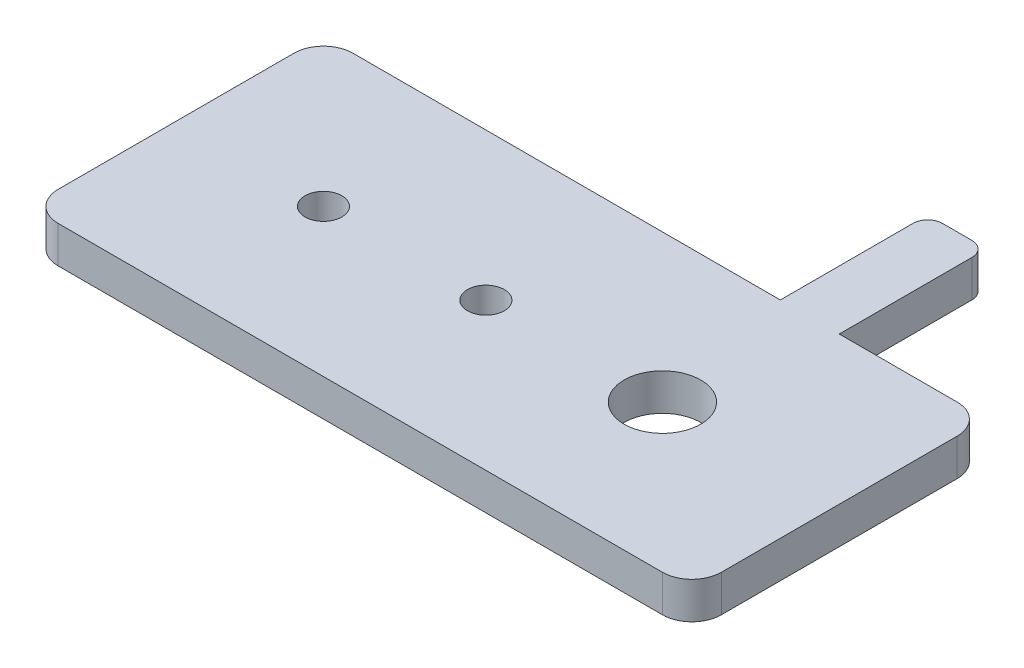
ISO-10303-21;
HEADER;
FILE_DESCRIPTION(('STEP AP214'),'2;1');
FILE_NAME('part.step','',(''),(''),'','','');
FILE_SCHEMA(('AUTOMOTIVE_DESIGN { 1 0 10303 214 1 1 1 1 }'));
ENDSEC;
DATA;
#1=APPLICATION_CONTEXT('core data for automotive mechanical design processes');
#2=APPLICATION_PROTOCOL_DEFINITION('international standard','automotive_design',2000,#1);
#3=PRODUCT_CONTEXT('',#1,'mechanical');
#4=PRODUCT('Part','Part','',(#3));
#5=PRODUCT_RELATED_PRODUCT_CATEGORY('part','',(#4));
#6=PRODUCT_DEFINITION_FORMATION('','',#4);
#7=PRODUCT_DEFINITION_CONTEXT('part definition',#1,'design');
#8=PRODUCT_DEFINITION('design','',#6,#7);
#9=PRODUCT_DEFINITION_SHAPE('','',#8);
#10=(LENGTH_UNIT() NAMED_UNIT(*) SI_UNIT(.MILLI.,.METRE.));
#11=(NAMED_UNIT(*) PLANE_ANGLE_UNIT() SI_UNIT($,.RADIAN.));
#12=(NAMED_UNIT(*) SI_UNIT($,.STERADIAN.) SOLID_ANGLE_UNIT());
#13=UNCERTAINTY_MEASURE_WITH_UNIT(LENGTH_MEASURE(1.E-05),#10,'distance_accuracy_value','');
#14=(GEOMETRIC_REPRESENTATION_CONTEXT(3) GLOBAL_UNCERTAINTY_ASSIGNED_CONTEXT((#13)) GLOBAL_UNIT_ASSIGNED_CONTEXT((#10,
#11,#12)) REPRESENTATION_CONTEXT('',''));
#15=CARTESIAN_POINT('',(0.,0.,0.));
#16=DIRECTION('',(0.,0.,1.));
#17=DIRECTION('',(1.,0.,0.));
#18=AXIS2_PLACEMENT_3D('',#15,#16,#17);
#19=CARTESIAN_POINT('',(54.61,3.175,-2.54));
#20=DIRECTION('',(0.,-1.,0.));
#21=DIRECTION('',(0.,0.,-1.));
#22=AXIS2_PLACEMENT_3D('',#19,#20,#21);
#23=CYLINDRICAL_SURFACE('',#22,2.54);
#24=CARTESIAN_POINT('',(54.61,0.,-2.54));
#25=DIRECTION('',(0.,1.,0.));
#26=DIRECTION('',(0.,0.,1.));
#27=AXIS2_PLACEMENT_3D('',#24,#25,#26);
#28=CIRCLE('',#27,2.54);
#29=CARTESIAN_POINT('',(54.61,0.,0.));
#30=VERTEX_POINT('',#29);
#31=CARTESIAN_POINT('',(57.15,0.,-2.54));
#32=VERTEX_POINT('',#31);
#33=EDGE_CURVE('E167',#30,#32,#28,.T.);
#34=ORIENTED_EDGE('',*,*,#33,.T.);
#35=DIRECTION('',(0.,-1.,0.));
#36=VECTOR('',#35,1.);
#37=CARTESIAN_POINT('',(57.15,3.175,-2.54));
#38=LINE('',#37,#36);
#39=CARTESIAN_POINT('',(57.15,3.175,-2.54));
#40=VERTEX_POINT('',#39);
#41=EDGE_CURVE('E11',#40,#32,#38,.T.);
#42=ORIENTED_EDGE('',*,*,#41,.F.);
#43=CARTESIAN_POINT('',(54.61,3.175,-2.54));
#44=DIRECTION('',(0.,1.,0.));
#45=DIRECTION('',(0.,0.,1.));
#46=AXIS2_PLACEMENT_3D('',#43,#44,#45);
#47=CIRCLE('',#46,2.54);
#48=CARTESIAN_POINT('',(54.61,3.175,0.));
#49=VERTEX_POINT('',#48);
#50=EDGE_CURVE('E194',#49,#40,#47,.T.);
#51=ORIENTED_EDGE('',*,*,#50,.F.);
#52=DIRECTION('',(0.,-1.,0.));
#53=VECTOR('',#52,1.);
#54=CARTESIAN_POINT('',(54.61,3.175,0.));
#55=LINE('',#54,#53);
#56=EDGE_CURVE('E163',#49,#30,#55,.T.);
#57=ORIENTED_EDGE('',*,*,#56,.T.);
#58=EDGE_LOOP('',(#34,#42,#51,#57));
#59=FACE_BOUND('',#58,.T.);
#60=ADVANCED_FACE('F35',(#59),#23,.T.);
#61=CARTESIAN_POINT('',(57.15,3.175,-2.54));
#62=DIRECTION('',(-1.,0.,0.));
#63=DIRECTION('',(0.,0.,1.));
#64=AXIS2_PLACEMENT_3D('',#61,#62,#63);
#65=PLANE('',#64);
#66=DIRECTION('',(0.,0.,-1.));
#67=VECTOR('',#66,1.);
#68=CARTESIAN_POINT('',(57.15,0.,-2.54));
#69=LINE('',#68,#67);
#70=CARTESIAN_POINT('',(57.15,0.,-22.86));
#71=VERTEX_POINT('',#70);
#72=EDGE_CURVE('E170',#32,#71,#69,.T.);
#73=ORIENTED_EDGE('',*,*,#72,.T.);
#74=DIRECTION('',(0.,-1.,0.));
#75=VECTOR('',#74,1.);
#76=CARTESIAN_POINT('',(57.15,3.175,-22.86));
#77=LINE('',#76,#75);
#78=CARTESIAN_POINT('',(57.15,3.175,-22.86));
#79=VERTEX_POINT('',#78);
#80=EDGE_CURVE('E43',#79,#71,#77,.T.);
#81=ORIENTED_EDGE('',*,*,#80,.F.);
#82=DIRECTION('',(0.,0.,-1.));
#83=VECTOR('',#82,1.);
#84=CARTESIAN_POINT('',(57.15,3.175,-2.54));
#85=LINE('',#84,#83);
#86=EDGE_CURVE('E112',#40,#79,#85,.T.);
#87=ORIENTED_EDGE('',*,*,#86,.F.);
#88=ORIENTED_EDGE('',*,*,#41,.T.);
#89=EDGE_LOOP('',(#73,#81,#87,#88));
#90=FACE_BOUND('',#89,.T.);
#91=ADVANCED_FACE('F283',(#90),#65,.F.);
#92=CARTESIAN_POINT('',(54.61,3.175,-22.86));
#93=DIRECTION('',(0.,-1.,0.));
#94=DIRECTION('',(0.,0.,-1.));
#95=AXIS2_PLACEMENT_3D('',#92,#93,#94);
#96=CYLINDRICAL_SURFACE('',#95,2.54);
#97=CARTESIAN_POINT('',(54.61,0.,-22.86));
#98=DIRECTION('',(0.,1.,0.));
#99=DIRECTION('',(0.,0.,-1.));
#100=AXIS2_PLACEMENT_3D('',#97,#98,#99);
#101=CIRCLE('',#100,2.54);
#102=CARTESIAN_POINT('',(54.61,0.,-25.4));
#103=VERTEX_POINT('',#102);
#104=EDGE_CURVE('E173',#71,#103,#101,.T.);
#105=ORIENTED_EDGE('',*,*,#104,.T.);
#106=DIRECTION('',(0.,-1.,0.));
#107=VECTOR('',#106,1.);
#108=CARTESIAN_POINT('',(54.61,3.175,-25.4));
#109=LINE('',#108,#107);
#110=CARTESIAN_POINT('',(54.61,3.175,-25.4));
#111=VERTEX_POINT('',#110);
#112=EDGE_CURVE('E219',#111,#103,#109,.T.);
#113=ORIENTED_EDGE('',*,*,#112,.F.);
#114=CARTESIAN_POINT('',(54.61,3.175,-22.86));
#115=DIRECTION('',(0.,1.,0.));
#116=DIRECTION('',(0.,0.,-1.));
#117=AXIS2_PLACEMENT_3D('',#114,#115,#116);
#118=CIRCLE('',#117,2.54);
#119=EDGE_CURVE('E227',#79,#111,#118,.T.);
#120=ORIENTED_EDGE('',*,*,#119,.F.);
#121=ORIENTED_EDGE('',*,*,#80,.T.);
#122=EDGE_LOOP('',(#105,#113,#120,#121));
#123=FACE_BOUND('',#122,.T.);
#124=ADVANCED_FACE('F225',(#123),#96,.T.);
#125=CARTESIAN_POINT('',(44.45,3.175,-25.4));
#126=DIRECTION('',(0.,0.,1.));
#127=DIRECTION('',(1.,0.,0.));
#128=AXIS2_PLACEMENT_3D('',#125,#126,#127);
#129=PLANE('',#128);
#130=DIRECTION('',(-1.,0.,0.));
#131=VECTOR('',#130,1.);
#132=CARTESIAN_POINT('',(44.45,0.,-25.4));
#133=LINE('',#132,#131);
#134=CARTESIAN_POINT('',(44.45,0.,-25.4));
#135=VERTEX_POINT('',#134);
#136=EDGE_CURVE('E175',#103,#135,#133,.T.);
#137=ORIENTED_EDGE('',*,*,#136,.T.);
#138=DIRECTION('',(0.,-1.,0.));
#139=VECTOR('',#138,1.);
#140=CARTESIAN_POINT('',(44.45,3.175,-25.4));
#141=LINE('',#140,#139);
#142=CARTESIAN_POINT('',(44.45,3.175,-25.4));
#143=VERTEX_POINT('',#142);
#144=EDGE_CURVE('E216',#143,#135,#141,.T.);
#145=ORIENTED_EDGE('',*,*,#144,.F.);
#146=DIRECTION('',(-1.,0.,0.));
#147=VECTOR('',#146,1.);
#148=CARTESIAN_POINT('',(44.45,3.175,-25.4));
#149=LINE('',#148,#147);
#150=EDGE_CURVE('E245',#111,#143,#149,.T.);
#151=ORIENTED_EDGE('',*,*,#150,.F.);
#152=ORIENTED_EDGE('',*,*,#112,.T.);
#153=EDGE_LOOP('',(#137,#145,#151,#152));
#154=FACE_BOUND('',#153,.T.);
#155=ADVANCED_FACE('F236',(#154),#129,.F.);
#156=CARTESIAN_POINT('',(44.45,3.175,-25.4));
#157=DIRECTION('',(-1.,0.,0.));
#158=DIRECTION('',(0.,0.,1.));
#159=AXIS2_PLACEMENT_3D('',#156,#157,#158);
#160=PLANE('',#159);
#161=DIRECTION('',(0.,0.,-1.));
#162=VECTOR('',#161,1.);
#163=CARTESIAN_POINT('',(44.45,0.,-25.4));
#164=LINE('',#163,#162);
#165=CARTESIAN_POINT('',(44.45,0.,-36.83));
#166=VERTEX_POINT('',#165);
#167=EDGE_CURVE('E177',#135,#166,#164,.T.);
#168=ORIENTED_EDGE('',*,*,#167,.T.);
#169=DIRECTION('',(0.,-1.,0.));
#170=VECTOR('',#169,1.);
#171=CARTESIAN_POINT('',(44.45,3.175,-36.83));
#172=LINE('',#171,#170);
#173=CARTESIAN_POINT('',(44.45,3.175,-36.83));
#174=VERTEX_POINT('',#173);
#175=EDGE_CURVE('E213',#174,#166,#172,.T.);
#176=ORIENTED_EDGE('',*,*,#175,.F.);
#177=DIRECTION('',(0.,0.,-1.));
#178=VECTOR('',#177,1.);
#179=CARTESIAN_POINT('',(44.45,3.175,-25.4));
#180=LINE('',#179,#178);
#181=EDGE_CURVE('E242',#143,#174,#180,.T.);
#182=ORIENTED_EDGE('',*,*,#181,.F.);
#183=ORIENTED_EDGE('',*,*,#144,.T.);
#184=EDGE_LOOP('',(#168,#176,#182,#183));
#185=FACE_BOUND('',#184,.T.);
#186=ADVANCED_FACE('F240',(#185),#160,.F.);
#187=CARTESIAN_POINT('',(43.18,3.175,-36.83));
#188=DIRECTION('',(0.,-1.,0.));
#189=DIRECTION('',(0.,0.,-1.));
#190=AXIS2_PLACEMENT_3D('',#187,#188,#189);
#191=CYLINDRICAL_SURFACE('',#190,1.27);
#192=CARTESIAN_POINT('',(43.18,0.,-36.83));
#193=DIRECTION('',(0.,1.,0.));
#194=DIRECTION('',(0.,0.,-1.));
#195=AXIS2_PLACEMENT_3D('',#192,#193,#194);
#196=CIRCLE('',#195,1.27);
#197=CARTESIAN_POINT('',(43.18,0.,-38.1));
#198=VERTEX_POINT('',#197);
#199=EDGE_CURVE('E179',#166,#198,#196,.T.);
#200=ORIENTED_EDGE('',*,*,#199,.T.);
#201=DIRECTION('',(0.,-1.,0.));
#202=VECTOR('',#201,1.);
#203=CARTESIAN_POINT('',(43.18,3.175,-38.1));
#204=LINE('',#203,#202);
#205=CARTESIAN_POINT('',(43.18,3.175,-38.1));
#206=VERTEX_POINT('',#205);
#207=EDGE_CURVE('E210',#206,#198,#204,.T.);
#208=ORIENTED_EDGE('',*,*,#207,.F.);
#209=CARTESIAN_POINT('',(43.18,3.175,-36.83));
#210=DIRECTION('',(0.,1.,0.));
#211=DIRECTION('',(0.,0.,-1.));
#212=AXIS2_PLACEMENT_3D('',#209,#210,#211);
#213=CIRCLE('',#212,1.27);
#214=EDGE_CURVE('E244',#174,#206,#213,.T.);
#215=ORIENTED_EDGE('',*,*,#214,.F.);
#216=ORIENTED_EDGE('',*,*,#175,.T.);
#217=EDGE_LOOP('',(#200,#208,#215,#216));
#218=FACE_BOUND('',#217,.T.);
#219=ADVANCED_FACE('F296',(#218),#191,.T.);
#220=CARTESIAN_POINT('',(40.64,3.175,-38.1));
#221=DIRECTION('',(0.,0.,1.));
#222=DIRECTION('',(1.,0.,0.));
#223=AXIS2_PLACEMENT_3D('',#220,#221,#222);
#224=PLANE('',#223);
#225=DIRECTION('',(-1.,0.,0.));
#226=VECTOR('',#225,1.);
#227=CARTESIAN_POINT('',(40.64,0.,-38.1));
#228=LINE('',#227,#226);
#229=CARTESIAN_POINT('',(40.64,0.,-38.1));
#230=VERTEX_POINT('',#229);
#231=EDGE_CURVE('E181',#198,#230,#228,.T.);
#232=ORIENTED_EDGE('',*,*,#231,.T.);
#233=DIRECTION('',(0.,-1.,0.));
#234=VECTOR('',#233,1.);
#235=CARTESIAN_POINT('',(40.64,3.175,-38.1));
#236=LINE('',#235,#234);
#237=CARTESIAN_POINT('',(40.64,3.175,-38.1));
#238=VERTEX_POINT('',#237);
#239=EDGE_CURVE('E207',#238,#230,#236,.T.);
#240=ORIENTED_EDGE('',*,*,#239,.F.);
#241=DIRECTION('',(-1.,0.,0.));
#242=VECTOR('',#241,1.);
#243=CARTESIAN_POINT('',(40.64,3.175,-38.1));
#244=LINE('',#243,#242);
#245=EDGE_CURVE('E247',#206,#238,#244,.T.);
#246=ORIENTED_EDGE('',*,*,#245,.F.);
#247=ORIENTED_EDGE('',*,*,#207,.T.);
#248=EDGE_LOOP('',(#232,#240,#246,#247));
#249=FACE_BOUND('',#248,.T.);
#250=ADVANCED_FACE('F299',(#249),#224,.F.);
#251=CARTESIAN_POINT('',(40.64,3.175,-36.83));
#252=DIRECTION('',(0.,-1.,0.));
#253=DIRECTION('',(0.,0.,-1.));
#254=AXIS2_PLACEMENT_3D('',#251,#252,#253);
#255=CYLINDRICAL_SURFACE('',#254,1.27);
#256=CARTESIAN_POINT('',(40.64,0.,-36.83));
#257=DIRECTION('',(0.,1.,0.));
#258=DIRECTION('',(0.,0.,-1.));
#259=AXIS2_PLACEMENT_3D('',#256,#257,#258);
#260=CIRCLE('',#259,1.27);
#261=CARTESIAN_POINT('',(39.37,0.,-36.83));
#262=VERTEX_POINT('',#261);
#263=EDGE_CURVE('E183',#230,#262,#260,.T.);
#264=ORIENTED_EDGE('',*,*,#263,.T.);
#265=DIRECTION('',(0.,-1.,0.));
#266=VECTOR('',#265,1.);
#267=CARTESIAN_POINT('',(39.37,3.175,-36.83));
#268=LINE('',#267,#266);
#269=CARTESIAN_POINT('',(39.37,3.175,-36.83));
#270=VERTEX_POINT('',#269);
#271=EDGE_CURVE('E204',#270,#262,#268,.T.);
#272=ORIENTED_EDGE('',*,*,#271,.F.);
#273=CARTESIAN_POINT('',(40.64,3.175,-36.83));
#274=DIRECTION('',(0.,1.,0.));
#275=DIRECTION('',(0.,0.,-1.));
#276=AXIS2_PLACEMENT_3D('',#273,#274,#275);
#277=CIRCLE('',#276,1.27);
#278=EDGE_CURVE('E253',#238,#270,#277,.T.);
#279=ORIENTED_EDGE('',*,*,#278,.F.);
#280=ORIENTED_EDGE('',*,*,#239,.T.);
#281=EDGE_LOOP('',(#264,#272,#279,#280));
#282=FACE_BOUND('',#281,.T.);
#283=ADVANCED_FACE('F303',(#282),#255,.T.);
#284=CARTESIAN_POINT('',(39.37,3.175,-25.4));
#285=DIRECTION('',(1.,0.,0.));
#286=DIRECTION('',(0.,0.,-1.));
#287=AXIS2_PLACEMENT_3D('',#284,#285,#286);
#288=PLANE('',#287);
#289=DIRECTION('',(0.,0.,1.));
#290=VECTOR('',#289,1.);
#291=CARTESIAN_POINT('',(39.37,0.,-25.4));
#292=LINE('',#291,#290);
#293=CARTESIAN_POINT('',(39.37,0.,-25.4));
#294=VERTEX_POINT('',#293);
#295=EDGE_CURVE('E185',#262,#294,#292,.T.);
#296=ORIENTED_EDGE('',*,*,#295,.T.);
#297=DIRECTION('',(0.,-1.,0.));
#298=VECTOR('',#297,1.);
#299=CARTESIAN_POINT('',(39.37,3.175,-25.4));
#300=LINE('',#299,#298);
#301=CARTESIAN_POINT('',(39.37,3.175,-25.4));
#302=VERTEX_POINT('',#301);
#303=EDGE_CURVE('E201',#302,#294,#300,.T.);
#304=ORIENTED_EDGE('',*,*,#303,.F.);
#305=DIRECTION('',(0.,0.,1.));
#306=VECTOR('',#305,1.);
#307=CARTESIAN_POINT('',(39.37,3.175,-25.4));
#308=LINE('',#307,#306);
#309=EDGE_CURVE('E255',#270,#302,#308,.T.);
#310=ORIENTED_EDGE('',*,*,#309,.F.);
#311=ORIENTED_EDGE('',*,*,#271,.T.);
#312=EDGE_LOOP('',(#296,#304,#310,#311));
#313=FACE_BOUND('',#312,.T.);
#314=ADVANCED_FACE('F307',(#313),#288,.F.);
#315=CARTESIAN_POINT('',(2.54000000000002,3.175,-25.4));
#316=DIRECTION('',(0.,0.,1.));
#317=DIRECTION('',(1.,0.,0.));
#318=AXIS2_PLACEMENT_3D('',#315,#316,#317);
#319=PLANE('',#318);
#320=DIRECTION('',(-1.,0.,0.));
#321=VECTOR('',#320,1.);
#322=CARTESIAN_POINT('',(2.54000000000002,0.,-25.4));
#323=LINE('',#322,#321);
#324=CARTESIAN_POINT('',(2.54000000000002,0.,-25.4));
#325=VERTEX_POINT('',#324);
#326=EDGE_CURVE('E187',#294,#325,#323,.T.);
#327=ORIENTED_EDGE('',*,*,#326,.T.);
#328=DIRECTION('',(0.,-1.,0.));
#329=VECTOR('',#328,1.);
#330=CARTESIAN_POINT('',(2.54000000000002,3.175,-25.4));
#331=LINE('',#330,#329);
#332=CARTESIAN_POINT('',(2.54000000000002,3.175,-25.4));
#333=VERTEX_POINT('',#332);
#334=EDGE_CURVE('E198',#333,#325,#331,.T.);
#335=ORIENTED_EDGE('',*,*,#334,.F.);
#336=DIRECTION('',(-1.,0.,0.));
#337=VECTOR('',#336,1.);
#338=CARTESIAN_POINT('',(2.54000000000002,3.175,-25.4));
#339=LINE('',#338,#337);
#340=EDGE_CURVE('E257',#302,#333,#339,.T.);
#341=ORIENTED_EDGE('',*,*,#340,.F.);
#342=ORIENTED_EDGE('',*,*,#303,.T.);
#343=EDGE_LOOP('',(#327,#335,#341,#342));
#344=FACE_BOUND('',#343,.T.);
#345=ADVANCED_FACE('F263',(#344),#319,.F.);
#346=CARTESIAN_POINT('',(2.54,3.175,-22.86));
#347=DIRECTION('',(0.,-1.,0.));
#348=DIRECTION('',(0.,0.,-1.));
#349=AXIS2_PLACEMENT_3D('',#346,#347,#348);
#350=CYLINDRICAL_SURFACE('',#349,2.54);
#351=CARTESIAN_POINT('',(2.54,0.,-22.86));
#352=DIRECTION('',(0.,1.,0.));
#353=DIRECTION('',(0.,0.,-1.));
#354=AXIS2_PLACEMENT_3D('',#351,#352,#353);
#355=CIRCLE('',#354,2.54);
#356=CARTESIAN_POINT('',(0.,0.,-22.86));
#357=VERTEX_POINT('',#356);
#358=EDGE_CURVE('E189',#325,#357,#355,.T.);
#359=ORIENTED_EDGE('',*,*,#358,.T.);
#360=DIRECTION('',(0.,-1.,0.));
#361=VECTOR('',#360,1.);
#362=CARTESIAN_POINT('',(0.,3.175,-22.86));
#363=LINE('',#362,#361);
#364=CARTESIAN_POINT('',(0.,3.175,-22.86));
#365=VERTEX_POINT('',#364);
#366=EDGE_CURVE('E158',#365,#357,#363,.T.);
#367=ORIENTED_EDGE('',*,*,#366,.F.);
#368=CARTESIAN_POINT('',(2.54,3.175,-22.86));
#369=DIRECTION('',(0.,1.,0.));
#370=DIRECTION('',(0.,0.,-1.));
#371=AXIS2_PLACEMENT_3D('',#368,#369,#370);
#372=CIRCLE('',#371,2.54);
#373=EDGE_CURVE('E149',#333,#365,#372,.T.);
#374=ORIENTED_EDGE('',*,*,#373,.F.);
#375=ORIENTED_EDGE('',*,*,#334,.T.);
#376=EDGE_LOOP('',(#359,#367,#374,#375));
#377=FACE_BOUND('',#376,.T.);
#378=ADVANCED_FACE('F267',(#377),#350,.T.);
#379=CARTESIAN_POINT('',(0.,3.175,-2.54000000000002));
#380=DIRECTION('',(1.,0.,0.));
#381=DIRECTION('',(0.,0.,-1.));
#382=AXIS2_PLACEMENT_3D('',#379,#380,#381);
#383=PLANE('',#382);
#384=DIRECTION('',(0.,0.,1.));
#385=VECTOR('',#384,1.);
#386=CARTESIAN_POINT('',(0.,0.,-2.54000000000002));
#387=LINE('',#386,#385);
#388=CARTESIAN_POINT('',(0.,0.,-2.54000000000002));
#389=VERTEX_POINT('',#388);
#390=EDGE_CURVE('E157',#357,#389,#387,.T.);
#391=ORIENTED_EDGE('',*,*,#390,.T.);
#392=DIRECTION('',(0.,-1.,0.));
#393=VECTOR('',#392,1.);
#394=CARTESIAN_POINT('',(0.,3.175,-2.54000000000002));
#395=LINE('',#394,#393);
#396=CARTESIAN_POINT('',(0.,3.175,-2.54000000000002));
#397=VERTEX_POINT('',#396);
#398=EDGE_CURVE('E154',#397,#389,#395,.T.);
#399=ORIENTED_EDGE('',*,*,#398,.F.);
#400=DIRECTION('',(0.,0.,1.));
#401=VECTOR('',#400,1.);
#402=CARTESIAN_POINT('',(0.,3.175,-2.54000000000002));
#403=LINE('',#402,#401);
#404=EDGE_CURVE('E143',#365,#397,#403,.T.);
#405=ORIENTED_EDGE('',*,*,#404,.F.);
#406=ORIENTED_EDGE('',*,*,#366,.T.);
#407=EDGE_LOOP('',(#391,#399,#405,#406));
#408=FACE_BOUND('',#407,.T.);
#409=ADVANCED_FACE('F155',(#408),#383,.F.);
#410=CARTESIAN_POINT('',(2.54,3.175,-2.54));
#411=DIRECTION('',(0.,-1.,0.));
#412=DIRECTION('',(0.,0.,-1.));
#413=AXIS2_PLACEMENT_3D('',#410,#411,#412);
#414=CYLINDRICAL_SURFACE('',#413,2.54);
#415=CARTESIAN_POINT('',(2.54,0.,-2.54));
#416=DIRECTION('',(0.,1.,0.));
#417=DIRECTION('',(0.,0.,-1.));
#418=AXIS2_PLACEMENT_3D('',#415,#416,#417);
#419=CIRCLE('',#418,2.54);
#420=CARTESIAN_POINT('',(2.54000000000002,0.,0.));
#421=VERTEX_POINT('',#420);
#422=EDGE_CURVE('E98',#389,#421,#419,.T.);
#423=ORIENTED_EDGE('',*,*,#422,.T.);
#424=DIRECTION('',(0.,-1.,0.));
#425=VECTOR('',#424,1.);
#426=CARTESIAN_POINT('',(2.54000000000002,3.175,0.));
#427=LINE('',#426,#425);
#428=CARTESIAN_POINT('',(2.54000000000002,3.175,0.));
#429=VERTEX_POINT('',#428);
#430=EDGE_CURVE('E159',#429,#421,#427,.T.);
#431=ORIENTED_EDGE('',*,*,#430,.F.);
#432=CARTESIAN_POINT('',(2.54,3.175,-2.54));
#433=DIRECTION('',(0.,1.,0.));
#434=DIRECTION('',(0.,0.,-1.));
#435=AXIS2_PLACEMENT_3D('',#432,#433,#434);
#436=CIRCLE('',#435,2.54);
#437=EDGE_CURVE('E147',#397,#429,#436,.T.);
#438=ORIENTED_EDGE('',*,*,#437,.F.);
#439=ORIENTED_EDGE('',*,*,#398,.T.);
#440=EDGE_LOOP('',(#423,#431,#438,#439));
#441=FACE_BOUND('',#440,.T.);
#442=ADVANCED_FACE('F161',(#441),#414,.T.);
#443=CARTESIAN_POINT('',(2.54000000000002,3.175,0.));
#444=DIRECTION('',(0.,0.,-1.));
#445=DIRECTION('',(-1.,0.,0.));
#446=AXIS2_PLACEMENT_3D('',#443,#444,#445);
#447=PLANE('',#446);
#448=DIRECTION('',(1.,0.,0.));
#449=VECTOR('',#448,1.);
#450=CARTESIAN_POINT('',(2.54000000000002,0.,0.));
#451=LINE('',#450,#449);
#452=EDGE_CURVE('E104',#421,#30,#451,.T.);
#453=ORIENTED_EDGE('',*,*,#452,.T.);
#454=ORIENTED_EDGE('',*,*,#56,.F.);
#455=DIRECTION('',(1.,0.,0.));
#456=VECTOR('',#455,1.);
#457=CARTESIAN_POINT('',(2.54000000000002,3.175,0.));
#458=LINE('',#457,#456);
#459=EDGE_CURVE('E51',#429,#49,#458,.T.);
#460=ORIENTED_EDGE('',*,*,#459,.F.);
#461=ORIENTED_EDGE('',*,*,#430,.T.);
#462=EDGE_LOOP('',(#453,#454,#460,#461));
#463=FACE_BOUND('',#462,.T.);
#464=ADVANCED_FACE('F271',(#463),#447,.F.);
#465=CARTESIAN_POINT('',(54.61,3.175,-2.54));
#466=DIRECTION('',(0.,1.,0.));
#467=DIRECTION('',(0.,0.,1.));
#468=AXIS2_PLACEMENT_3D('',#465,#466,#467);
#469=PLANE('',#468);
#470=CARTESIAN_POINT('',(41.91,3.175,-12.7));
#471=DIRECTION('',(0.,1.,0.));
#472=DIRECTION('',(0.,0.,1.));
#473=AXIS2_PLACEMENT_3D('',#470,#471,#472);
#474=CIRCLE('',#473,3.302);
#475=CARTESIAN_POINT('',(41.91,3.175,-9.398));
#476=VERTEX_POINT('',#475);
#477=EDGE_CURVE('E380',#476,#476,#474,.T.);
#478=ORIENTED_EDGE('',*,*,#477,.F.);
#479=EDGE_LOOP('',(#478));
#480=FACE_BOUND('',#479,.T.);
#481=CARTESIAN_POINT('',(26.699972,3.175,-12.7));
#482=DIRECTION('',(0.,1.,0.));
#483=DIRECTION('',(0.,0.,1.));
#484=AXIS2_PLACEMENT_3D('',#481,#482,#483);
#485=CIRCLE('',#484,1.5875);
#486=CARTESIAN_POINT('',(26.699972,3.175,-11.1125));
#487=VERTEX_POINT('',#486);
#488=EDGE_CURVE('E384',#487,#487,#485,.T.);
#489=ORIENTED_EDGE('',*,*,#488,.F.);
#490=EDGE_LOOP('',(#489));
#491=FACE_BOUND('',#490,.T.);
#492=CARTESIAN_POINT('',(12.7,3.175,-12.7));
#493=DIRECTION('',(0.,1.,0.));
#494=DIRECTION('',(0.,0.,1.));
#495=AXIS2_PLACEMENT_3D('',#492,#493,#494);
#496=CIRCLE('',#495,1.5875);
#497=CARTESIAN_POINT('',(12.7,3.175,-11.1125));
#498=VERTEX_POINT('',#497);
#499=EDGE_CURVE('E393',#498,#498,#496,.T.);
#500=ORIENTED_EDGE('',*,*,#499,.F.);
#501=EDGE_LOOP('',(#500));
#502=FACE_BOUND('',#501,.T.);
#503=ORIENTED_EDGE('',*,*,#50,.T.);
#504=ORIENTED_EDGE('',*,*,#86,.T.);
#505=ORIENTED_EDGE('',*,*,#119,.T.);
#506=ORIENTED_EDGE('',*,*,#150,.T.);
#507=ORIENTED_EDGE('',*,*,#181,.T.);
#508=ORIENTED_EDGE('',*,*,#214,.T.);
#509=ORIENTED_EDGE('',*,*,#245,.T.);
#510=ORIENTED_EDGE('',*,*,#278,.T.);
#511=ORIENTED_EDGE('',*,*,#309,.T.);
#512=ORIENTED_EDGE('',*,*,#340,.T.);
#513=ORIENTED_EDGE('',*,*,#373,.T.);
#514=ORIENTED_EDGE('',*,*,#404,.T.);
#515=ORIENTED_EDGE('',*,*,#437,.T.);
#516=ORIENTED_EDGE('',*,*,#459,.T.);
#517=EDGE_LOOP('',(#503,#504,#505,#506,#507,#508,#509,#510,#511,#512,#513,#514,#515,#516));
#518=FACE_BOUND('',#517,.T.);
#519=ADVANCED_FACE('F145',(#480,#491,#502,#518),#469,.T.);
#520=CARTESIAN_POINT('',(54.61,0.,-2.54));
#521=DIRECTION('',(0.,1.,0.));
#522=DIRECTION('',(0.,0.,1.));
#523=AXIS2_PLACEMENT_3D('',#520,#521,#522);
#524=PLANE('',#523);
#525=CARTESIAN_POINT('',(41.91,0.,-12.7));
#526=DIRECTION('',(0.,1.,0.));
#527=DIRECTION('',(0.,0.,1.));
#528=AXIS2_PLACEMENT_3D('',#525,#526,#527);
#529=CIRCLE('',#528,3.302);
#530=CARTESIAN_POINT('',(41.91,0.,-9.398));
#531=VERTEX_POINT('',#530);
#532=EDGE_CURVE('E383',#531,#531,#529,.F.);
#533=ORIENTED_EDGE('',*,*,#532,.F.);
#534=EDGE_LOOP('',(#533));
#535=FACE_BOUND('',#534,.T.);
#536=CARTESIAN_POINT('',(26.699972,0.,-12.7));
#537=DIRECTION('',(0.,1.,0.));
#538=DIRECTION('',(0.,0.,1.));
#539=AXIS2_PLACEMENT_3D('',#536,#537,#538);
#540=CIRCLE('',#539,1.5875);
#541=CARTESIAN_POINT('',(26.699972,0.,-11.1125));
#542=VERTEX_POINT('',#541);
#543=EDGE_CURVE('E387',#542,#542,#540,.F.);
#544=ORIENTED_EDGE('',*,*,#543,.F.);
#545=EDGE_LOOP('',(#544));
#546=FACE_BOUND('',#545,.T.);
#547=CARTESIAN_POINT('',(12.7,0.,-12.7));
#548=DIRECTION('',(0.,1.,0.));
#549=DIRECTION('',(0.,0.,1.));
#550=AXIS2_PLACEMENT_3D('',#547,#548,#549);
#551=CIRCLE('',#550,1.5875);
#552=CARTESIAN_POINT('',(12.7,0.,-11.1125));
#553=VERTEX_POINT('',#552);
#554=EDGE_CURVE('E171',#553,#553,#551,.F.);
#555=ORIENTED_EDGE('',*,*,#554,.F.);
#556=EDGE_LOOP('',(#555));
#557=FACE_BOUND('',#556,.T.);
#558=ORIENTED_EDGE('',*,*,#33,.F.);
#559=ORIENTED_EDGE('',*,*,#452,.F.);
#560=ORIENTED_EDGE('',*,*,#422,.F.);
#561=ORIENTED_EDGE('',*,*,#390,.F.);
#562=ORIENTED_EDGE('',*,*,#358,.F.);
#563=ORIENTED_EDGE('',*,*,#326,.F.);
#564=ORIENTED_EDGE('',*,*,#295,.F.);
#565=ORIENTED_EDGE('',*,*,#263,.F.);
#566=ORIENTED_EDGE('',*,*,#231,.F.);
#567=ORIENTED_EDGE('',*,*,#199,.F.);
#568=ORIENTED_EDGE('',*,*,#167,.F.);
#569=ORIENTED_EDGE('',*,*,#136,.F.);
#570=ORIENTED_EDGE('',*,*,#104,.F.);
#571=ORIENTED_EDGE('',*,*,#72,.F.);
#572=EDGE_LOOP('',(#558,#559,#560,#561,#562,#563,#564,#565,#566,#567,#568,#569,#570,#571));
#573=FACE_BOUND('',#572,.T.);
#574=ADVANCED_FACE('F231',(#535,#546,#557,#573),#524,.F.);
#575=CARTESIAN_POINT('',(12.7,-0.00100000000000013,-12.7));
#576=DIRECTION('',(0.,1.,0.));
#577=DIRECTION('',(0.,0.,1.));
#578=AXIS2_PLACEMENT_3D('',#575,#576,#577);
#579=CYLINDRICAL_SURFACE('',#578,1.5875);
#580=ORIENTED_EDGE('',*,*,#499,.T.);
#581=EDGE_LOOP('',(#580));
#582=FACE_BOUND('',#581,.T.);
#583=ORIENTED_EDGE('',*,*,#554,.T.);
#584=EDGE_LOOP('',(#583));
#585=FACE_BOUND('',#584,.T.);
#586=ADVANCED_FACE('F344',(#582,#585),#579,.F.);
#587=CARTESIAN_POINT('',(26.699972,-0.00100000000000013,-12.7));
#588=DIRECTION('',(0.,1.,0.));
#589=DIRECTION('',(0.,0.,1.));
#590=AXIS2_PLACEMENT_3D('',#587,#588,#589);
#591=CYLINDRICAL_SURFACE('',#590,1.5875);
#592=ORIENTED_EDGE('',*,*,#488,.T.);
#593=EDGE_LOOP('',(#592));
#594=FACE_BOUND('',#593,.T.);
#595=ORIENTED_EDGE('',*,*,#543,.T.);
#596=EDGE_LOOP('',(#595));
#597=FACE_BOUND('',#596,.T.);
#598=ADVANCED_FACE('F353',(#594,#597),#591,.F.);
#599=CARTESIAN_POINT('',(41.91,-0.00100000000000013,-12.7));
#600=DIRECTION('',(0.,1.,0.));
#601=DIRECTION('',(0.,0.,1.));
#602=AXIS2_PLACEMENT_3D('',#599,#600,#601);
#603=CYLINDRICAL_SURFACE('',#602,3.302);
#604=ORIENTED_EDGE('',*,*,#477,.T.);
#605=EDGE_LOOP('',(#604));
#606=FACE_BOUND('',#605,.T.);
#607=ORIENTED_EDGE('',*,*,#532,.T.);
#608=EDGE_LOOP('',(#607));
#609=FACE_BOUND('',#608,.T.);
#610=ADVANCED_FACE('F363',(#606,#609),#603,.F.);
#611=CLOSED_SHELL('',(#60,#91,#124,#155,#186,#219,#250,#283,#314,#345,#378,#409,#442,#464,#519,
#574,#586,#598,#610));
#612=MANIFOLD_SOLID_BREP('B2',#611);
#613=ADVANCED_BREP_SHAPE_REPRESENTATION('',(#18,#612),#14);
#614=SHAPE_DEFINITION_REPRESENTATION(#9,#613);
ENDSEC;
END-ISO-10303-21;
